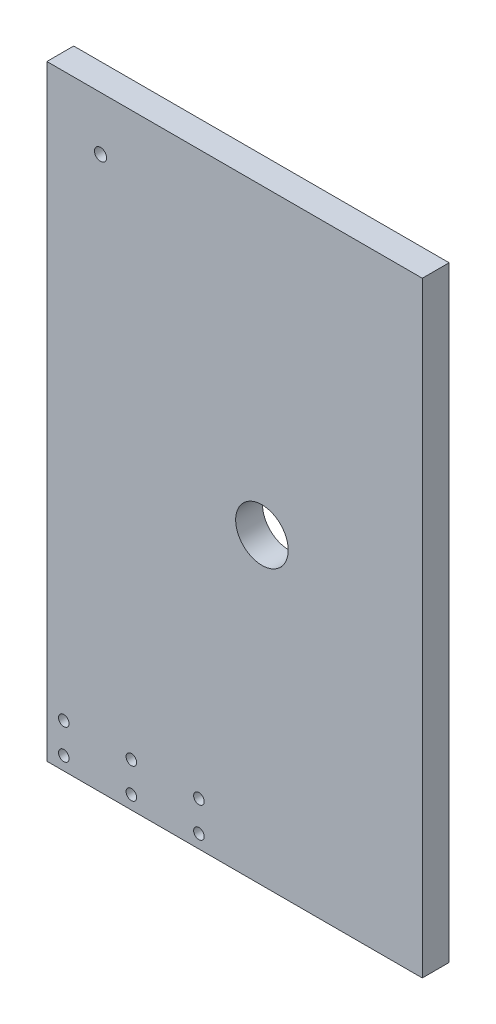
ISO-10303-21;
HEADER;
FILE_DESCRIPTION(('STEP AP214'),'2;1');
FILE_NAME('part.step','',(''),(''),'','','');
FILE_SCHEMA(('AUTOMOTIVE_DESIGN { 1 0 10303 214 1 1 1 1 }'));
ENDSEC;
DATA;
#1=APPLICATION_CONTEXT('core data for automotive mechanical design processes');
#2=APPLICATION_PROTOCOL_DEFINITION('international standard','automotive_design',2000,#1);
#3=PRODUCT_CONTEXT('',#1,'mechanical');
#4=PRODUCT('Part','Part','',(#3));
#5=PRODUCT_RELATED_PRODUCT_CATEGORY('part','',(#4));
#6=PRODUCT_DEFINITION_FORMATION('','',#4);
#7=PRODUCT_DEFINITION_CONTEXT('part definition',#1,'design');
#8=PRODUCT_DEFINITION('design','',#6,#7);
#9=PRODUCT_DEFINITION_SHAPE('','',#8);
#10=(LENGTH_UNIT() NAMED_UNIT(*) SI_UNIT(.MILLI.,.METRE.));
#11=(NAMED_UNIT(*) PLANE_ANGLE_UNIT() SI_UNIT($,.RADIAN.));
#12=(NAMED_UNIT(*) SI_UNIT($,.STERADIAN.) SOLID_ANGLE_UNIT());
#13=UNCERTAINTY_MEASURE_WITH_UNIT(LENGTH_MEASURE(1.E-05),#10,'distance_accuracy_value','');
#14=(GEOMETRIC_REPRESENTATION_CONTEXT(3) GLOBAL_UNCERTAINTY_ASSIGNED_CONTEXT((#13)) GLOBAL_UNIT_ASSIGNED_CONTEXT((#10,
#11,#12)) REPRESENTATION_CONTEXT('',''));
#15=CARTESIAN_POINT('',(0.,0.,0.));
#16=DIRECTION('',(0.,0.,1.));
#17=DIRECTION('',(1.,0.,0.));
#18=AXIS2_PLACEMENT_3D('',#15,#16,#17);
#19=CARTESIAN_POINT('',(0.,71.755,6.35));
#20=DIRECTION('',(0.,1.,0.));
#21=DIRECTION('',(0.,0.,1.));
#22=AXIS2_PLACEMENT_3D('',#19,#20,#21);
#23=PLANE('',#22);
#24=DIRECTION('',(0.,0.,-1.));
#25=VECTOR('',#24,1.);
#26=CARTESIAN_POINT('',(12.7,71.755,6.35));
#27=LINE('',#26,#25);
#28=CARTESIAN_POINT('',(12.7,71.755,6.35));
#29=VERTEX_POINT('',#28);
#30=CARTESIAN_POINT('',(12.7,71.755,0.));
#31=VERTEX_POINT('',#30);
#32=EDGE_CURVE('E110',#29,#31,#27,.T.);
#33=ORIENTED_EDGE('',*,*,#32,.T.);
#34=DIRECTION('',(1.,0.,0.));
#35=VECTOR('',#34,1.);
#36=CARTESIAN_POINT('',(0.,71.755,0.));
#37=LINE('',#36,#35);
#38=CARTESIAN_POINT('',(-76.2,71.755,0.));
#39=VERTEX_POINT('',#38);
#40=EDGE_CURVE('E97',#39,#31,#37,.T.);
#41=ORIENTED_EDGE('',*,*,#40,.F.);
#42=DIRECTION('',(0.,0.,-1.));
#43=VECTOR('',#42,1.);
#44=CARTESIAN_POINT('',(-76.2,71.755,6.35));
#45=LINE('',#44,#43);
#46=CARTESIAN_POINT('',(-76.2,71.755,6.35));
#47=VERTEX_POINT('',#46);
#48=EDGE_CURVE('E11',#47,#39,#45,.T.);
#49=ORIENTED_EDGE('',*,*,#48,.F.);
#50=DIRECTION('',(1.,0.,0.));
#51=VECTOR('',#50,1.);
#52=CARTESIAN_POINT('',(0.,71.755,6.35));
#53=LINE('',#52,#51);
#54=EDGE_CURVE('E116',#47,#29,#53,.T.);
#55=ORIENTED_EDGE('',*,*,#54,.T.);
#56=EDGE_LOOP('',(#33,#41,#49,#55));
#57=FACE_BOUND('',#56,.T.);
#58=ADVANCED_FACE('F43',(#57),#23,.T.);
#59=CARTESIAN_POINT('',(-76.2,0.,6.35));
#60=DIRECTION('',(1.,0.,0.));
#61=DIRECTION('',(0.,1.,0.));
#62=AXIS2_PLACEMENT_3D('',#59,#60,#61);
#63=PLANE('',#62);
#64=DIRECTION('',(0.,-1.,0.));
#65=VECTOR('',#64,1.);
#66=CARTESIAN_POINT('',(-76.2,0.,0.));
#67=LINE('',#66,#65);
#68=CARTESIAN_POINT('',(-76.2,-71.755,0.));
#69=VERTEX_POINT('',#68);
#70=EDGE_CURVE('E84',#39,#69,#67,.T.);
#71=ORIENTED_EDGE('',*,*,#70,.T.);
#72=DIRECTION('',(0.,0.,-1.));
#73=VECTOR('',#72,1.);
#74=CARTESIAN_POINT('',(-76.2,-71.755,6.35));
#75=LINE('',#74,#73);
#76=CARTESIAN_POINT('',(-76.2,-71.755,6.35));
#77=VERTEX_POINT('',#76);
#78=EDGE_CURVE('E52',#77,#69,#75,.T.);
#79=ORIENTED_EDGE('',*,*,#78,.F.);
#80=DIRECTION('',(0.,-1.,0.));
#81=VECTOR('',#80,1.);
#82=CARTESIAN_POINT('',(-76.2,0.,6.35));
#83=LINE('',#82,#81);
#84=EDGE_CURVE('E113',#47,#77,#83,.T.);
#85=ORIENTED_EDGE('',*,*,#84,.F.);
#86=ORIENTED_EDGE('',*,*,#48,.T.);
#87=EDGE_LOOP('',(#71,#79,#85,#86));
#88=FACE_BOUND('',#87,.T.);
#89=ADVANCED_FACE('F95',(#88),#63,.F.);
#90=CARTESIAN_POINT('',(-63.5,59.055,6.35));
#91=DIRECTION('',(0.,0.,-1.));
#92=DIRECTION('',(-1.,0.,0.));
#93=AXIS2_PLACEMENT_3D('',#90,#91,#92);
#94=CYLINDRICAL_SURFACE('',#93,1.4375);
#95=CARTESIAN_POINT('',(-63.5,59.055,6.35));
#96=DIRECTION('',(0.,0.,1.));
#97=DIRECTION('',(1.,0.,0.));
#98=AXIS2_PLACEMENT_3D('',#95,#96,#97);
#99=CIRCLE('',#98,1.4375);
#100=CARTESIAN_POINT('',(-62.0625,59.055,6.35));
#101=VERTEX_POINT('',#100);
#102=EDGE_CURVE('E120',#101,#101,#99,.T.);
#103=ORIENTED_EDGE('',*,*,#102,.T.);
#104=EDGE_LOOP('',(#103));
#105=FACE_BOUND('',#104,.T.);
#106=CARTESIAN_POINT('',(-63.5,59.055,0.));
#107=DIRECTION('',(0.,0.,1.));
#108=DIRECTION('',(1.,0.,0.));
#109=AXIS2_PLACEMENT_3D('',#106,#107,#108);
#110=CIRCLE('',#109,1.4375);
#111=CARTESIAN_POINT('',(-62.0625,59.055,0.));
#112=VERTEX_POINT('',#111);
#113=EDGE_CURVE('E100',#112,#112,#110,.T.);
#114=ORIENTED_EDGE('',*,*,#113,.F.);
#115=EDGE_LOOP('',(#114));
#116=FACE_BOUND('',#115,.T.);
#117=ADVANCED_FACE('F209',(#105,#116),#94,.F.);
#118=CARTESIAN_POINT('',(-25.2727251737746,0.100300785330471,6.35));
#119=DIRECTION('',(0.,0.,-1.));
#120=DIRECTION('',(-1.,0.,0.));
#121=AXIS2_PLACEMENT_3D('',#118,#119,#120);
#122=CYLINDRICAL_SURFACE('',#121,6.223);
#123=CARTESIAN_POINT('',(-25.2727251737746,0.100300785330471,6.35));
#124=DIRECTION('',(0.,0.,1.));
#125=DIRECTION('',(1.,0.,0.));
#126=AXIS2_PLACEMENT_3D('',#123,#124,#125);
#127=CIRCLE('',#126,6.223);
#128=CARTESIAN_POINT('',(-19.0497251737746,0.100300785330471,6.35));
#129=VERTEX_POINT('',#128);
#130=EDGE_CURVE('E88',#129,#129,#127,.T.);
#131=ORIENTED_EDGE('',*,*,#130,.T.);
#132=EDGE_LOOP('',(#131));
#133=FACE_BOUND('',#132,.T.);
#134=CARTESIAN_POINT('',(-25.2727251737746,0.100300785330471,0.));
#135=DIRECTION('',(0.,0.,1.));
#136=DIRECTION('',(1.,0.,0.));
#137=AXIS2_PLACEMENT_3D('',#134,#135,#136);
#138=CIRCLE('',#137,6.223);
#139=CARTESIAN_POINT('',(-19.0497251737746,0.100300785330471,0.));
#140=VERTEX_POINT('',#139);
#141=EDGE_CURVE('E106',#140,#140,#138,.T.);
#142=ORIENTED_EDGE('',*,*,#141,.F.);
#143=EDGE_LOOP('',(#142));
#144=FACE_BOUND('',#143,.T.);
#145=ADVANCED_FACE('F45',(#133,#144),#122,.F.);
#146=CARTESIAN_POINT('',(0.,-71.755,6.35));
#147=DIRECTION('',(0.,1.,0.));
#148=DIRECTION('',(-1.,0.,0.));
#149=AXIS2_PLACEMENT_3D('',#146,#147,#148);
#150=PLANE('',#149);
#151=DIRECTION('',(1.,0.,0.));
#152=VECTOR('',#151,1.);
#153=CARTESIAN_POINT('',(0.,-71.755,0.));
#154=LINE('',#153,#152);
#155=CARTESIAN_POINT('',(12.7,-71.755,0.));
#156=VERTEX_POINT('',#155);
#157=EDGE_CURVE('E80',#69,#156,#154,.T.);
#158=ORIENTED_EDGE('',*,*,#157,.T.);
#159=DIRECTION('',(0.,0.,-1.));
#160=VECTOR('',#159,1.);
#161=CARTESIAN_POINT('',(12.7,-71.755,6.35));
#162=LINE('',#161,#160);
#163=CARTESIAN_POINT('',(12.7,-71.755,6.35));
#164=VERTEX_POINT('',#163);
#165=EDGE_CURVE('E59',#164,#156,#162,.T.);
#166=ORIENTED_EDGE('',*,*,#165,.F.);
#167=DIRECTION('',(1.,0.,0.));
#168=VECTOR('',#167,1.);
#169=CARTESIAN_POINT('',(0.,-71.755,6.35));
#170=LINE('',#169,#168);
#171=EDGE_CURVE('E67',#77,#164,#170,.T.);
#172=ORIENTED_EDGE('',*,*,#171,.F.);
#173=ORIENTED_EDGE('',*,*,#78,.T.);
#174=EDGE_LOOP('',(#158,#166,#172,#173));
#175=FACE_BOUND('',#174,.T.);
#176=ADVANCED_FACE('F91',(#175),#150,.F.);
#177=CARTESIAN_POINT('',(0.,0.,6.35));
#178=DIRECTION('',(0.,0.,1.));
#179=DIRECTION('',(1.,0.,0.));
#180=AXIS2_PLACEMENT_3D('',#177,#178,#179);
#181=PLANE('',#180);
#182=CARTESIAN_POINT('',(-56.2,-61.404999872,6.35));
#183=DIRECTION('',(0.,0.,-1.));
#184=DIRECTION('',(-1.,0.,0.));
#185=AXIS2_PLACEMENT_3D('',#182,#183,#184);
#186=CIRCLE('',#185,1.25);
#187=CARTESIAN_POINT('',(-57.45,-61.404999872,6.35));
#188=VERTEX_POINT('',#187);
#189=EDGE_CURVE('E143',#188,#188,#186,.T.);
#190=ORIENTED_EDGE('',*,*,#189,.T.);
#191=EDGE_LOOP('',(#190));
#192=FACE_BOUND('',#191,.T.);
#193=CARTESIAN_POINT('',(-40.2,-61.404999872,6.35));
#194=DIRECTION('',(0.,0.,-1.));
#195=DIRECTION('',(-1.,0.,0.));
#196=AXIS2_PLACEMENT_3D('',#193,#194,#195);
#197=CIRCLE('',#196,1.25);
#198=CARTESIAN_POINT('',(-41.45,-61.404999872,6.35));
#199=VERTEX_POINT('',#198);
#200=EDGE_CURVE('E168',#199,#199,#197,.T.);
#201=ORIENTED_EDGE('',*,*,#200,.T.);
#202=EDGE_LOOP('',(#201));
#203=FACE_BOUND('',#202,.T.);
#204=CARTESIAN_POINT('',(-72.2,-68.58,6.35));
#205=DIRECTION('',(0.,0.,-1.));
#206=DIRECTION('',(-1.,0.,0.));
#207=AXIS2_PLACEMENT_3D('',#204,#205,#206);
#208=CIRCLE('',#207,1.25);
#209=CARTESIAN_POINT('',(-73.45,-68.58,6.35));
#210=VERTEX_POINT('',#209);
#211=EDGE_CURVE('E160',#210,#210,#208,.T.);
#212=ORIENTED_EDGE('',*,*,#211,.T.);
#213=EDGE_LOOP('',(#212));
#214=FACE_BOUND('',#213,.T.);
#215=CARTESIAN_POINT('',(-56.2,-68.58,6.35));
#216=DIRECTION('',(0.,0.,-1.));
#217=DIRECTION('',(-1.,0.,0.));
#218=AXIS2_PLACEMENT_3D('',#215,#216,#217);
#219=CIRCLE('',#218,1.25);
#220=CARTESIAN_POINT('',(-57.45,-68.58,6.35));
#221=VERTEX_POINT('',#220);
#222=EDGE_CURVE('E151',#221,#221,#219,.T.);
#223=ORIENTED_EDGE('',*,*,#222,.T.);
#224=EDGE_LOOP('',(#223));
#225=FACE_BOUND('',#224,.T.);
#226=CARTESIAN_POINT('',(-40.2,-68.58,6.35));
#227=DIRECTION('',(0.,0.,-1.));
#228=DIRECTION('',(-1.,0.,0.));
#229=AXIS2_PLACEMENT_3D('',#226,#227,#228);
#230=CIRCLE('',#229,1.25);
#231=CARTESIAN_POINT('',(-41.45,-68.58,6.35));
#232=VERTEX_POINT('',#231);
#233=EDGE_CURVE('E152',#232,#232,#230,.T.);
#234=ORIENTED_EDGE('',*,*,#233,.T.);
#235=EDGE_LOOP('',(#234));
#236=FACE_BOUND('',#235,.T.);
#237=CARTESIAN_POINT('',(-72.2,-61.404999872,6.35));
#238=DIRECTION('',(0.,0.,-1.));
#239=DIRECTION('',(-1.,0.,0.));
#240=AXIS2_PLACEMENT_3D('',#237,#238,#239);
#241=CIRCLE('',#240,1.25);
#242=CARTESIAN_POINT('',(-73.45,-61.404999872,6.35));
#243=VERTEX_POINT('',#242);
#244=EDGE_CURVE('E135',#243,#243,#241,.T.);
#245=ORIENTED_EDGE('',*,*,#244,.T.);
#246=EDGE_LOOP('',(#245));
#247=FACE_BOUND('',#246,.T.);
#248=DIRECTION('',(0.,1.,0.));
#249=VECTOR('',#248,1.);
#250=CARTESIAN_POINT('',(12.7,71.755,6.35));
#251=LINE('',#250,#249);
#252=EDGE_CURVE('E129',#164,#29,#251,.T.);
#253=ORIENTED_EDGE('',*,*,#252,.T.);
#254=ORIENTED_EDGE('',*,*,#54,.F.);
#255=ORIENTED_EDGE('',*,*,#84,.T.);
#256=ORIENTED_EDGE('',*,*,#171,.T.);
#257=EDGE_LOOP('',(#253,#254,#255,#256));
#258=FACE_BOUND('',#257,.T.);
#259=ORIENTED_EDGE('',*,*,#130,.F.);
#260=EDGE_LOOP('',(#259));
#261=FACE_BOUND('',#260,.T.);
#262=ORIENTED_EDGE('',*,*,#102,.F.);
#263=EDGE_LOOP('',(#262));
#264=FACE_BOUND('',#263,.T.);
#265=ADVANCED_FACE('F187',(#192,#203,#214,#225,#236,#247,#258,#261,#264),#181,.T.);
#266=CARTESIAN_POINT('',(0.,0.,0.));
#267=DIRECTION('',(0.,0.,1.));
#268=DIRECTION('',(1.,0.,0.));
#269=AXIS2_PLACEMENT_3D('',#266,#267,#268);
#270=PLANE('',#269);
#271=CARTESIAN_POINT('',(-56.2,-61.404999872,0.));
#272=DIRECTION('',(0.,0.,-1.));
#273=DIRECTION('',(-1.,0.,0.));
#274=AXIS2_PLACEMENT_3D('',#271,#272,#273);
#275=CIRCLE('',#274,1.25);
#276=CARTESIAN_POINT('',(-57.45,-61.404999872,0.));
#277=VERTEX_POINT('',#276);
#278=EDGE_CURVE('E172',#277,#277,#275,.T.);
#279=ORIENTED_EDGE('',*,*,#278,.F.);
#280=EDGE_LOOP('',(#279));
#281=FACE_BOUND('',#280,.T.);
#282=CARTESIAN_POINT('',(-40.2,-61.404999872,0.));
#283=DIRECTION('',(0.,0.,-1.));
#284=DIRECTION('',(-1.,0.,0.));
#285=AXIS2_PLACEMENT_3D('',#282,#283,#284);
#286=CIRCLE('',#285,1.25);
#287=CARTESIAN_POINT('',(-41.45,-61.404999872,0.));
#288=VERTEX_POINT('',#287);
#289=EDGE_CURVE('E164',#288,#288,#286,.T.);
#290=ORIENTED_EDGE('',*,*,#289,.F.);
#291=EDGE_LOOP('',(#290));
#292=FACE_BOUND('',#291,.T.);
#293=CARTESIAN_POINT('',(-72.2,-68.58,0.));
#294=DIRECTION('',(0.,0.,-1.));
#295=DIRECTION('',(-1.,0.,0.));
#296=AXIS2_PLACEMENT_3D('',#293,#294,#295);
#297=CIRCLE('',#296,1.25);
#298=CARTESIAN_POINT('',(-73.45,-68.58,0.));
#299=VERTEX_POINT('',#298);
#300=EDGE_CURVE('E156',#299,#299,#297,.T.);
#301=ORIENTED_EDGE('',*,*,#300,.F.);
#302=EDGE_LOOP('',(#301));
#303=FACE_BOUND('',#302,.T.);
#304=CARTESIAN_POINT('',(-56.2,-68.58,0.));
#305=DIRECTION('',(0.,0.,-1.));
#306=DIRECTION('',(-1.,0.,0.));
#307=AXIS2_PLACEMENT_3D('',#304,#305,#306);
#308=CIRCLE('',#307,1.25);
#309=CARTESIAN_POINT('',(-57.45,-68.58,0.));
#310=VERTEX_POINT('',#309);
#311=EDGE_CURVE('E147',#310,#310,#308,.T.);
#312=ORIENTED_EDGE('',*,*,#311,.F.);
#313=EDGE_LOOP('',(#312));
#314=FACE_BOUND('',#313,.T.);
#315=CARTESIAN_POINT('',(-40.2,-68.58,0.));
#316=DIRECTION('',(0.,0.,-1.));
#317=DIRECTION('',(-1.,0.,0.));
#318=AXIS2_PLACEMENT_3D('',#315,#316,#317);
#319=CIRCLE('',#318,1.25);
#320=CARTESIAN_POINT('',(-41.45,-68.58,0.));
#321=VERTEX_POINT('',#320);
#322=EDGE_CURVE('E179',#321,#321,#319,.T.);
#323=ORIENTED_EDGE('',*,*,#322,.F.);
#324=EDGE_LOOP('',(#323));
#325=FACE_BOUND('',#324,.T.);
#326=CARTESIAN_POINT('',(-72.2,-61.404999872,0.));
#327=DIRECTION('',(0.,0.,-1.));
#328=DIRECTION('',(-1.,0.,0.));
#329=AXIS2_PLACEMENT_3D('',#326,#327,#328);
#330=CIRCLE('',#329,1.25);
#331=CARTESIAN_POINT('',(-73.45,-61.404999872,0.));
#332=VERTEX_POINT('',#331);
#333=EDGE_CURVE('E139',#332,#332,#330,.T.);
#334=ORIENTED_EDGE('',*,*,#333,.F.);
#335=EDGE_LOOP('',(#334));
#336=FACE_BOUND('',#335,.T.);
#337=ORIENTED_EDGE('',*,*,#141,.T.);
#338=EDGE_LOOP('',(#337));
#339=FACE_BOUND('',#338,.T.);
#340=ORIENTED_EDGE('',*,*,#113,.T.);
#341=EDGE_LOOP('',(#340));
#342=FACE_BOUND('',#341,.T.);
#343=ORIENTED_EDGE('',*,*,#40,.T.);
#344=DIRECTION('',(0.,1.,0.));
#345=VECTOR('',#344,1.);
#346=CARTESIAN_POINT('',(12.7,71.755,0.));
#347=LINE('',#346,#345);
#348=EDGE_CURVE('E86',#156,#31,#347,.T.);
#349=ORIENTED_EDGE('',*,*,#348,.F.);
#350=ORIENTED_EDGE('',*,*,#157,.F.);
#351=ORIENTED_EDGE('',*,*,#70,.F.);
#352=EDGE_LOOP('',(#343,#349,#350,#351));
#353=FACE_BOUND('',#352,.T.);
#354=ADVANCED_FACE('F82',(#281,#292,#303,#314,#325,#336,#339,#342,#353),#270,.F.);
#355=CARTESIAN_POINT('',(12.7,71.755,6.35));
#356=DIRECTION('',(-1.,0.,0.));
#357=DIRECTION('',(0.,-1.,0.));
#358=AXIS2_PLACEMENT_3D('',#355,#356,#357);
#359=PLANE('',#358);
#360=ORIENTED_EDGE('',*,*,#348,.T.);
#361=ORIENTED_EDGE('',*,*,#32,.F.);
#362=ORIENTED_EDGE('',*,*,#252,.F.);
#363=ORIENTED_EDGE('',*,*,#165,.T.);
#364=EDGE_LOOP('',(#360,#361,#362,#363));
#365=FACE_BOUND('',#364,.T.);
#366=ADVANCED_FACE('F200',(#365),#359,.F.);
#367=CARTESIAN_POINT('',(-72.2,-61.404999872,6.35));
#368=DIRECTION('',(0.,0.,-1.));
#369=DIRECTION('',(-1.,0.,0.));
#370=AXIS2_PLACEMENT_3D('',#367,#368,#369);
#371=CYLINDRICAL_SURFACE('',#370,1.25);
#372=ORIENTED_EDGE('',*,*,#244,.F.);
#373=EDGE_LOOP('',(#372));
#374=FACE_BOUND('',#373,.T.);
#375=ORIENTED_EDGE('',*,*,#333,.T.);
#376=EDGE_LOOP('',(#375));
#377=FACE_BOUND('',#376,.T.);
#378=ADVANCED_FACE('F194',(#374,#377),#371,.F.);
#379=CARTESIAN_POINT('',(-40.2,-68.58,6.35));
#380=DIRECTION('',(0.,0.,-1.));
#381=DIRECTION('',(-1.,0.,0.));
#382=AXIS2_PLACEMENT_3D('',#379,#380,#381);
#383=CYLINDRICAL_SURFACE('',#382,1.25);
#384=ORIENTED_EDGE('',*,*,#233,.F.);
#385=EDGE_LOOP('',(#384));
#386=FACE_BOUND('',#385,.T.);
#387=ORIENTED_EDGE('',*,*,#322,.T.);
#388=EDGE_LOOP('',(#387));
#389=FACE_BOUND('',#388,.T.);
#390=ADVANCED_FACE('F190',(#386,#389),#383,.F.);
#391=CARTESIAN_POINT('',(-56.2,-68.58,6.35));
#392=DIRECTION('',(0.,0.,-1.));
#393=DIRECTION('',(-1.,0.,0.));
#394=AXIS2_PLACEMENT_3D('',#391,#392,#393);
#395=CYLINDRICAL_SURFACE('',#394,1.25);
#396=ORIENTED_EDGE('',*,*,#222,.F.);
#397=EDGE_LOOP('',(#396));
#398=FACE_BOUND('',#397,.T.);
#399=ORIENTED_EDGE('',*,*,#311,.T.);
#400=EDGE_LOOP('',(#399));
#401=FACE_BOUND('',#400,.T.);
#402=ADVANCED_FACE('F193',(#398,#401),#395,.F.);
#403=CARTESIAN_POINT('',(-72.2,-68.58,6.35));
#404=DIRECTION('',(0.,0.,-1.));
#405=DIRECTION('',(-1.,0.,0.));
#406=AXIS2_PLACEMENT_3D('',#403,#404,#405);
#407=CYLINDRICAL_SURFACE('',#406,1.25);
#408=ORIENTED_EDGE('',*,*,#211,.F.);
#409=EDGE_LOOP('',(#408));
#410=FACE_BOUND('',#409,.T.);
#411=ORIENTED_EDGE('',*,*,#300,.T.);
#412=EDGE_LOOP('',(#411));
#413=FACE_BOUND('',#412,.T.);
#414=ADVANCED_FACE('F236',(#410,#413),#407,.F.);
#415=CARTESIAN_POINT('',(-40.2,-61.404999872,6.35));
#416=DIRECTION('',(0.,0.,-1.));
#417=DIRECTION('',(-1.,0.,0.));
#418=AXIS2_PLACEMENT_3D('',#415,#416,#417);
#419=CYLINDRICAL_SURFACE('',#418,1.25);
#420=ORIENTED_EDGE('',*,*,#200,.F.);
#421=EDGE_LOOP('',(#420));
#422=FACE_BOUND('',#421,.T.);
#423=ORIENTED_EDGE('',*,*,#289,.T.);
#424=EDGE_LOOP('',(#423));
#425=FACE_BOUND('',#424,.T.);
#426=ADVANCED_FACE('F240',(#422,#425),#419,.F.);
#427=CARTESIAN_POINT('',(-56.2,-61.404999872,6.35));
#428=DIRECTION('',(0.,0.,-1.));
#429=DIRECTION('',(-1.,0.,0.));
#430=AXIS2_PLACEMENT_3D('',#427,#428,#429);
#431=CYLINDRICAL_SURFACE('',#430,1.25);
#432=ORIENTED_EDGE('',*,*,#189,.F.);
#433=EDGE_LOOP('',(#432));
#434=FACE_BOUND('',#433,.T.);
#435=ORIENTED_EDGE('',*,*,#278,.T.);
#436=EDGE_LOOP('',(#435));
#437=FACE_BOUND('',#436,.T.);
#438=ADVANCED_FACE('F244',(#434,#437),#431,.F.);
#439=CLOSED_SHELL('',(#58,#89,#117,#145,#176,#265,#354,#366,#378,#390,#402,#414,#426,#438));
#440=MANIFOLD_SOLID_BREP('B2',#439);
#441=ADVANCED_BREP_SHAPE_REPRESENTATION('',(#18,#440),#14);
#442=SHAPE_DEFINITION_REPRESENTATION(#9,#441);
ENDSEC;
END-ISO-10303-21;
